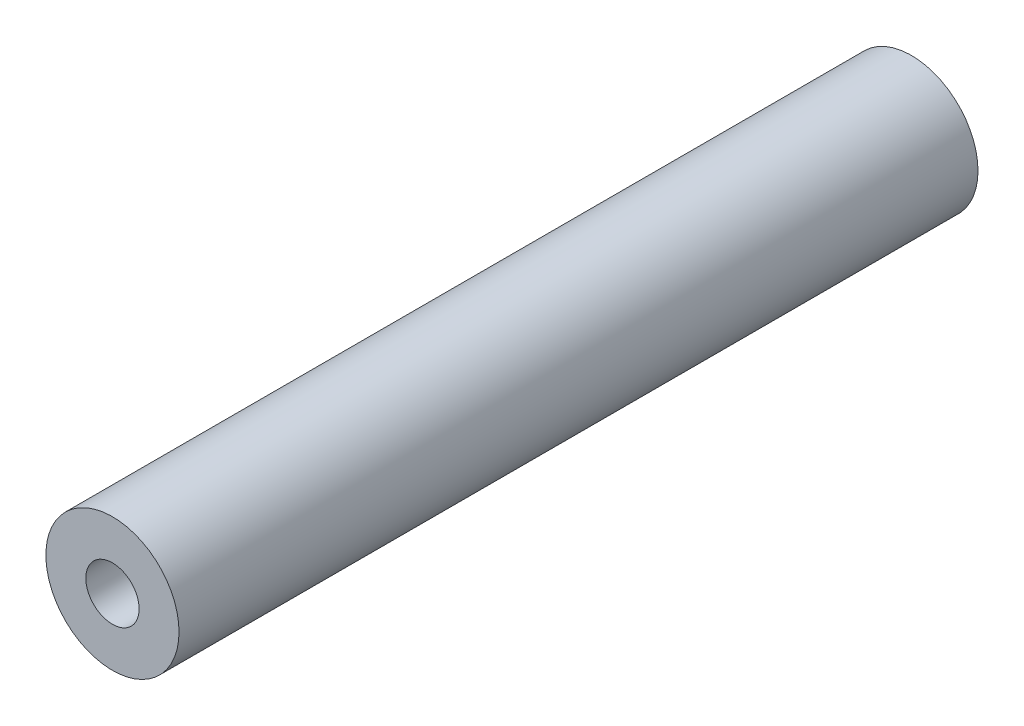
ISO-10303-21;
HEADER;
FILE_DESCRIPTION(('STEP AP214'),'2;1');
FILE_NAME('part.step','',(''),(''),'','','');
FILE_SCHEMA(('AUTOMOTIVE_DESIGN { 1 0 10303 214 1 1 1 1 }'));
ENDSEC;
DATA;
#1=APPLICATION_CONTEXT('core data for automotive mechanical design processes');
#2=APPLICATION_PROTOCOL_DEFINITION('international standard','automotive_design',2000,#1);
#3=PRODUCT_CONTEXT('',#1,'mechanical');
#4=PRODUCT('Part','Part','',(#3));
#5=PRODUCT_RELATED_PRODUCT_CATEGORY('part','',(#4));
#6=PRODUCT_DEFINITION_FORMATION('','',#4);
#7=PRODUCT_DEFINITION_CONTEXT('part definition',#1,'design');
#8=PRODUCT_DEFINITION('design','',#6,#7);
#9=PRODUCT_DEFINITION_SHAPE('','',#8);
#10=(LENGTH_UNIT() NAMED_UNIT(*) SI_UNIT(.MILLI.,.METRE.));
#11=(NAMED_UNIT(*) PLANE_ANGLE_UNIT() SI_UNIT($,.RADIAN.));
#12=(NAMED_UNIT(*) SI_UNIT($,.STERADIAN.) SOLID_ANGLE_UNIT());
#13=UNCERTAINTY_MEASURE_WITH_UNIT(LENGTH_MEASURE(1.E-05),#10,'distance_accuracy_value','');
#14=(GEOMETRIC_REPRESENTATION_CONTEXT(3) GLOBAL_UNCERTAINTY_ASSIGNED_CONTEXT((#13)) GLOBAL_UNIT_ASSIGNED_CONTEXT((#10,
#11,#12)) REPRESENTATION_CONTEXT('',''));
#15=CARTESIAN_POINT('',(0.,0.,0.));
#16=DIRECTION('',(0.,0.,1.));
#17=DIRECTION('',(1.,0.,0.));
#18=AXIS2_PLACEMENT_3D('',#15,#16,#17);
#19=CARTESIAN_POINT('',(0.,0.,60.));
#20=DIRECTION('',(0.,0.,1.));
#21=DIRECTION('',(1.,0.,0.));
#22=AXIS2_PLACEMENT_3D('',#19,#20,#21);
#23=PLANE('',#22);
#24=CARTESIAN_POINT('',(0.,0.,60.));
#25=DIRECTION('',(0.,0.,1.));
#26=DIRECTION('',(1.,0.,0.));
#27=AXIS2_PLACEMENT_3D('',#24,#25,#26);
#28=CIRCLE('',#27,5.);
#29=CARTESIAN_POINT('',(5.,0.,60.));
#30=VERTEX_POINT('',#29);
#31=EDGE_CURVE('E10',#30,#30,#28,.T.);
#32=ORIENTED_EDGE('',*,*,#31,.T.);
#33=EDGE_LOOP('',(#32));
#34=FACE_BOUND('',#33,.T.);
#35=CARTESIAN_POINT('',(0.,0.,60.));
#36=DIRECTION('',(0.,0.,1.));
#37=DIRECTION('',(1.,0.,0.));
#38=AXIS2_PLACEMENT_3D('',#35,#36,#37);
#39=CIRCLE('',#38,2.);
#40=CARTESIAN_POINT('',(2.,0.,60.));
#41=VERTEX_POINT('',#40);
#42=EDGE_CURVE('E42',#41,#41,#39,.T.);
#43=ORIENTED_EDGE('',*,*,#42,.F.);
#44=EDGE_LOOP('',(#43));
#45=FACE_BOUND('',#44,.T.);
#46=ADVANCED_FACE('F31',(#34,#45),#23,.T.);
#47=CARTESIAN_POINT('',(0.,0.,0.));
#48=DIRECTION('',(0.,0.,1.));
#49=DIRECTION('',(1.,0.,0.));
#50=AXIS2_PLACEMENT_3D('',#47,#48,#49);
#51=PLANE('',#50);
#52=CARTESIAN_POINT('',(0.,0.,0.));
#53=DIRECTION('',(0.,0.,1.));
#54=DIRECTION('',(1.,0.,0.));
#55=AXIS2_PLACEMENT_3D('',#52,#53,#54);
#56=CIRCLE('',#55,5.);
#57=CARTESIAN_POINT('',(5.,0.,0.));
#58=VERTEX_POINT('',#57);
#59=EDGE_CURVE('E35',#58,#58,#56,.T.);
#60=ORIENTED_EDGE('',*,*,#59,.F.);
#61=EDGE_LOOP('',(#60));
#62=FACE_BOUND('',#61,.T.);
#63=CARTESIAN_POINT('',(0.,0.,0.));
#64=DIRECTION('',(0.,0.,1.));
#65=DIRECTION('',(1.,0.,0.));
#66=AXIS2_PLACEMENT_3D('',#63,#64,#65);
#67=CIRCLE('',#66,2.);
#68=CARTESIAN_POINT('',(2.,0.,0.));
#69=VERTEX_POINT('',#68);
#70=EDGE_CURVE('E44',#69,#69,#67,.T.);
#71=ORIENTED_EDGE('',*,*,#70,.T.);
#72=EDGE_LOOP('',(#71));
#73=FACE_BOUND('',#72,.T.);
#74=ADVANCED_FACE('F54',(#62,#73),#51,.F.);
#75=CARTESIAN_POINT('',(0.,0.,60.));
#76=DIRECTION('',(0.,0.,-1.));
#77=DIRECTION('',(-1.,0.,0.));
#78=AXIS2_PLACEMENT_3D('',#75,#76,#77);
#79=CYLINDRICAL_SURFACE('',#78,5.);
#80=ORIENTED_EDGE('',*,*,#31,.F.);
#81=EDGE_LOOP('',(#80));
#82=FACE_BOUND('',#81,.T.);
#83=ORIENTED_EDGE('',*,*,#59,.T.);
#84=EDGE_LOOP('',(#83));
#85=FACE_BOUND('',#84,.T.);
#86=ADVANCED_FACE('F33',(#82,#85),#79,.T.);
#87=CARTESIAN_POINT('',(0.,0.,60.));
#88=DIRECTION('',(0.,0.,-1.));
#89=DIRECTION('',(-1.,0.,0.));
#90=AXIS2_PLACEMENT_3D('',#87,#88,#89);
#91=CYLINDRICAL_SURFACE('',#90,2.);
#92=ORIENTED_EDGE('',*,*,#42,.T.);
#93=EDGE_LOOP('',(#92));
#94=FACE_BOUND('',#93,.T.);
#95=ORIENTED_EDGE('',*,*,#70,.F.);
#96=EDGE_LOOP('',(#95));
#97=FACE_BOUND('',#96,.T.);
#98=ADVANCED_FACE('F50',(#94,#97),#91,.F.);
#99=CLOSED_SHELL('',(#46,#74,#86,#98));
#100=MANIFOLD_SOLID_BREP('B2',#99);
#101=ADVANCED_BREP_SHAPE_REPRESENTATION('',(#18,#100),#14);
#102=SHAPE_DEFINITION_REPRESENTATION(#9,#101);
ENDSEC;
END-ISO-10303-21;
